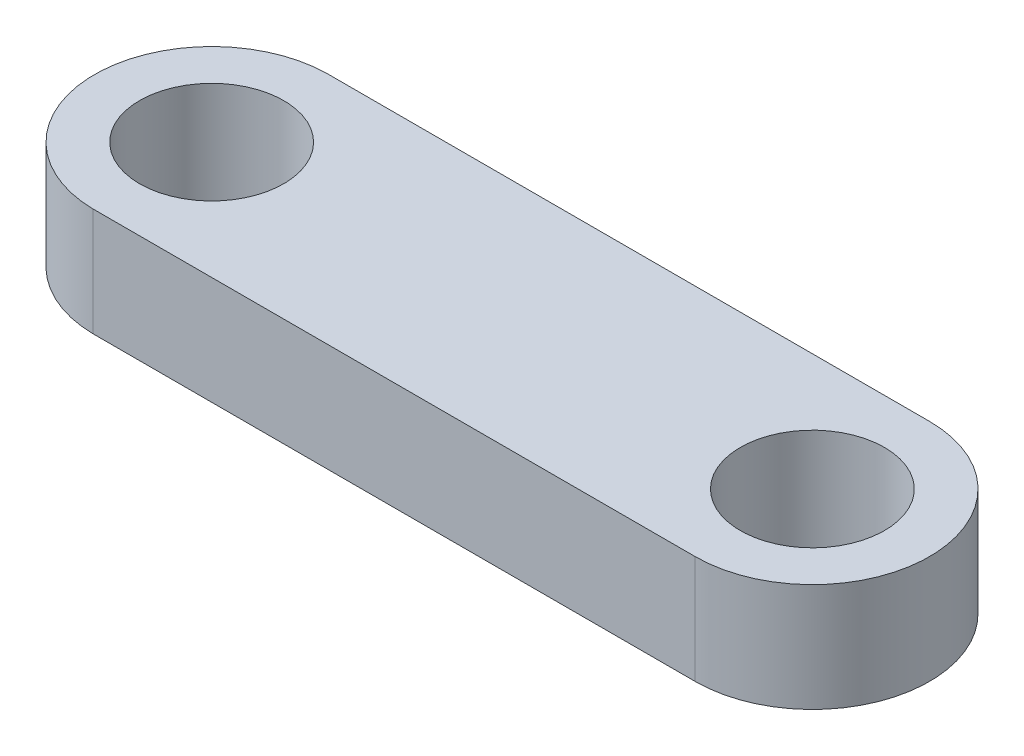
ISO-10303-21;
HEADER;
FILE_DESCRIPTION(('STEP AP214'),'2;1');
FILE_NAME('part.step','',(''),(''),'','','');
FILE_SCHEMA(('AUTOMOTIVE_DESIGN { 1 0 10303 214 1 1 1 1 }'));
ENDSEC;
DATA;
#1=APPLICATION_CONTEXT('core data for automotive mechanical design processes');
#2=APPLICATION_PROTOCOL_DEFINITION('international standard','automotive_design',2000,#1);
#3=PRODUCT_CONTEXT('',#1,'mechanical');
#4=PRODUCT('Part','Part','',(#3));
#5=PRODUCT_RELATED_PRODUCT_CATEGORY('part','',(#4));
#6=PRODUCT_DEFINITION_FORMATION('','',#4);
#7=PRODUCT_DEFINITION_CONTEXT('part definition',#1,'design');
#8=PRODUCT_DEFINITION('design','',#6,#7);
#9=PRODUCT_DEFINITION_SHAPE('','',#8);
#10=(LENGTH_UNIT() NAMED_UNIT(*) SI_UNIT(.MILLI.,.METRE.));
#11=(NAMED_UNIT(*) PLANE_ANGLE_UNIT() SI_UNIT($,.RADIAN.));
#12=(NAMED_UNIT(*) SI_UNIT($,.STERADIAN.) SOLID_ANGLE_UNIT());
#13=UNCERTAINTY_MEASURE_WITH_UNIT(LENGTH_MEASURE(1.E-05),#10,'distance_accuracy_value','');
#14=(GEOMETRIC_REPRESENTATION_CONTEXT(3) GLOBAL_UNCERTAINTY_ASSIGNED_CONTEXT((#13)) GLOBAL_UNIT_ASSIGNED_CONTEXT((#10,
#11,#12)) REPRESENTATION_CONTEXT('',''));
#15=CARTESIAN_POINT('',(0.,0.,0.));
#16=DIRECTION('',(0.,0.,1.));
#17=DIRECTION('',(1.,0.,0.));
#18=AXIS2_PLACEMENT_3D('',#15,#16,#17);
#19=CARTESIAN_POINT('',(-8.4455,3.81,-3.302));
#20=DIRECTION('',(0.,1.,0.));
#21=DIRECTION('',(0.,0.,1.));
#22=AXIS2_PLACEMENT_3D('',#19,#20,#21);
#23=PLANE('',#22);
#24=CARTESIAN_POINT('',(42.2275,3.81,-3.302));
#25=DIRECTION('',(0.,1.,0.));
#26=DIRECTION('',(0.,0.,1.));
#27=AXIS2_PLACEMENT_3D('',#24,#25,#26);
#28=CIRCLE('',#27,3.048);
#29=CARTESIAN_POINT('',(42.2275,3.81,-6.35));
#30=VERTEX_POINT('',#29);
#31=EDGE_CURVE('E104',#30,#30,#28,.T.);
#32=ORIENTED_EDGE('',*,*,#31,.F.);
#33=EDGE_LOOP('',(#32));
#34=FACE_BOUND('',#33,.T.);
#35=CARTESIAN_POINT('',(16.8275,3.81,-3.302));
#36=DIRECTION('',(0.,1.,0.));
#37=DIRECTION('',(0.,0.,1.));
#38=AXIS2_PLACEMENT_3D('',#35,#36,#37);
#39=CIRCLE('',#38,3.048);
#40=CARTESIAN_POINT('',(16.8275,3.81,-0.254000000000002));
#41=VERTEX_POINT('',#40);
#42=EDGE_CURVE('E117',#41,#41,#39,.T.);
#43=ORIENTED_EDGE('',*,*,#42,.F.);
#44=EDGE_LOOP('',(#43));
#45=FACE_BOUND('',#44,.T.);
#46=DIRECTION('',(-1.,0.,0.));
#47=VECTOR('',#46,1.);
#48=CARTESIAN_POINT('',(-8.4455,3.81,-8.255));
#49=LINE('',#48,#47);
#50=CARTESIAN_POINT('',(42.2275,3.81,-8.255));
#51=VERTEX_POINT('',#50);
#52=CARTESIAN_POINT('',(16.7640000000001,3.81,-8.255));
#53=VERTEX_POINT('',#52);
#54=EDGE_CURVE('E90',#51,#53,#49,.T.);
#55=ORIENTED_EDGE('',*,*,#54,.T.);
#56=CARTESIAN_POINT('',(16.8275,3.81,-3.302));
#57=DIRECTION('',(0.,1.,0.));
#58=DIRECTION('',(0.,0.,1.));
#59=AXIS2_PLACEMENT_3D('',#56,#57,#58);
#60=CIRCLE('',#59,4.95340703455712);
#61=CARTESIAN_POINT('',(16.7640000000001,3.81,1.651));
#62=VERTEX_POINT('',#61);
#63=EDGE_CURVE('E54',#53,#62,#60,.T.);
#64=ORIENTED_EDGE('',*,*,#63,.T.);
#65=DIRECTION('',(1.,0.,0.));
#66=VECTOR('',#65,1.);
#67=CARTESIAN_POINT('',(-8.4455,3.81,1.651));
#68=LINE('',#67,#66);
#69=CARTESIAN_POINT('',(42.2275,3.81,1.651));
#70=VERTEX_POINT('',#69);
#71=EDGE_CURVE('E97',#62,#70,#68,.T.);
#72=ORIENTED_EDGE('',*,*,#71,.T.);
#73=CARTESIAN_POINT('',(42.2275,3.81,-3.302));
#74=DIRECTION('',(0.,1.,0.));
#75=DIRECTION('',(0.,0.,-1.));
#76=AXIS2_PLACEMENT_3D('',#73,#74,#75);
#77=CIRCLE('',#76,4.953);
#78=EDGE_CURVE('E63',#70,#51,#77,.T.);
#79=ORIENTED_EDGE('',*,*,#78,.T.);
#80=EDGE_LOOP('',(#55,#64,#72,#79));
#81=FACE_BOUND('',#80,.T.);
#82=ADVANCED_FACE('F38',(#34,#45,#81),#23,.T.);
#83=CARTESIAN_POINT('',(-8.4455,-0.762,-3.302));
#84=DIRECTION('',(0.,1.,0.));
#85=DIRECTION('',(0.,0.,1.));
#86=AXIS2_PLACEMENT_3D('',#83,#84,#85);
#87=PLANE('',#86);
#88=CARTESIAN_POINT('',(42.2275,-0.762,-3.302));
#89=DIRECTION('',(0.,1.,0.));
#90=DIRECTION('',(0.,0.,1.));
#91=AXIS2_PLACEMENT_3D('',#88,#89,#90);
#92=CIRCLE('',#91,3.048);
#93=CARTESIAN_POINT('',(42.2275,-0.762000000000001,-6.35));
#94=VERTEX_POINT('',#93);
#95=EDGE_CURVE('E109',#94,#94,#92,.T.);
#96=ORIENTED_EDGE('',*,*,#95,.T.);
#97=EDGE_LOOP('',(#96));
#98=FACE_BOUND('',#97,.T.);
#99=CARTESIAN_POINT('',(16.8275,-0.762,-3.302));
#100=DIRECTION('',(0.,1.,0.));
#101=DIRECTION('',(0.,0.,1.));
#102=AXIS2_PLACEMENT_3D('',#99,#100,#101);
#103=CIRCLE('',#102,3.048);
#104=CARTESIAN_POINT('',(16.8275,-0.762,-0.254000000000002));
#105=VERTEX_POINT('',#104);
#106=EDGE_CURVE('E113',#105,#105,#103,.T.);
#107=ORIENTED_EDGE('',*,*,#106,.T.);
#108=EDGE_LOOP('',(#107));
#109=FACE_BOUND('',#108,.T.);
#110=CARTESIAN_POINT('',(16.8275,-0.762,-3.302));
#111=DIRECTION('',(0.,1.,0.));
#112=DIRECTION('',(0.,0.,1.));
#113=AXIS2_PLACEMENT_3D('',#110,#111,#112);
#114=CIRCLE('',#113,4.95340703455712);
#115=CARTESIAN_POINT('',(16.764,-0.762,-8.255));
#116=VERTEX_POINT('',#115);
#117=CARTESIAN_POINT('',(16.7640000000001,-0.762,1.651));
#118=VERTEX_POINT('',#117);
#119=EDGE_CURVE('E95',#116,#118,#114,.T.);
#120=ORIENTED_EDGE('',*,*,#119,.F.);
#121=DIRECTION('',(-1.,0.,0.));
#122=VECTOR('',#121,1.);
#123=CARTESIAN_POINT('',(-8.4455,-0.762,-8.255));
#124=LINE('',#123,#122);
#125=CARTESIAN_POINT('',(42.2275,-0.762,-8.255));
#126=VERTEX_POINT('',#125);
#127=EDGE_CURVE('E84',#126,#116,#124,.T.);
#128=ORIENTED_EDGE('',*,*,#127,.F.);
#129=CARTESIAN_POINT('',(42.2275,-0.762,-3.302));
#130=DIRECTION('',(0.,1.,0.));
#131=DIRECTION('',(0.,0.,-1.));
#132=AXIS2_PLACEMENT_3D('',#129,#130,#131);
#133=CIRCLE('',#132,4.953);
#134=CARTESIAN_POINT('',(42.2275,-0.762,1.651));
#135=VERTEX_POINT('',#134);
#136=EDGE_CURVE('E75',#135,#126,#133,.T.);
#137=ORIENTED_EDGE('',*,*,#136,.F.);
#138=DIRECTION('',(1.,0.,0.));
#139=VECTOR('',#138,1.);
#140=CARTESIAN_POINT('',(-8.4455,-0.762,1.651));
#141=LINE('',#140,#139);
#142=EDGE_CURVE('E85',#118,#135,#141,.T.);
#143=ORIENTED_EDGE('',*,*,#142,.F.);
#144=EDGE_LOOP('',(#120,#128,#137,#143));
#145=FACE_BOUND('',#144,.T.);
#146=ADVANCED_FACE('F93',(#98,#109,#145),#87,.F.);
#147=CARTESIAN_POINT('',(-8.4455,3.81,1.651));
#148=DIRECTION('',(0.,0.,-1.));
#149=DIRECTION('',(-1.,0.,0.));
#150=AXIS2_PLACEMENT_3D('',#147,#148,#149);
#151=PLANE('',#150);
#152=DIRECTION('',(0.,1.,0.));
#153=VECTOR('',#152,1.);
#154=CARTESIAN_POINT('',(16.7640000000001,-0.762,1.651));
#155=LINE('',#154,#153);
#156=EDGE_CURVE('E125',#118,#62,#155,.T.);
#157=ORIENTED_EDGE('',*,*,#156,.F.);
#158=ORIENTED_EDGE('',*,*,#142,.T.);
#159=DIRECTION('',(0.,-1.,0.));
#160=VECTOR('',#159,1.);
#161=CARTESIAN_POINT('',(42.2275,3.81,1.651));
#162=LINE('',#161,#160);
#163=EDGE_CURVE('E11',#70,#135,#162,.T.);
#164=ORIENTED_EDGE('',*,*,#163,.F.);
#165=ORIENTED_EDGE('',*,*,#71,.F.);
#166=EDGE_LOOP('',(#157,#158,#164,#165));
#167=FACE_BOUND('',#166,.T.);
#168=ADVANCED_FACE('F40',(#167),#151,.F.);
#169=CARTESIAN_POINT('',(-8.4455,3.81,-8.255));
#170=DIRECTION('',(0.,0.,1.));
#171=DIRECTION('',(1.,0.,0.));
#172=AXIS2_PLACEMENT_3D('',#169,#170,#171);
#173=PLANE('',#172);
#174=DIRECTION('',(0.,1.,0.));
#175=VECTOR('',#174,1.);
#176=CARTESIAN_POINT('',(16.764,-0.762,-8.255));
#177=LINE('',#176,#175);
#178=EDGE_CURVE('E121',#116,#53,#177,.T.);
#179=ORIENTED_EDGE('',*,*,#178,.T.);
#180=ORIENTED_EDGE('',*,*,#54,.F.);
#181=DIRECTION('',(0.,-1.,0.));
#182=VECTOR('',#181,1.);
#183=CARTESIAN_POINT('',(42.2275,3.81,-8.255));
#184=LINE('',#183,#182);
#185=EDGE_CURVE('E47',#51,#126,#184,.T.);
#186=ORIENTED_EDGE('',*,*,#185,.T.);
#187=ORIENTED_EDGE('',*,*,#127,.T.);
#188=EDGE_LOOP('',(#179,#180,#186,#187));
#189=FACE_BOUND('',#188,.T.);
#190=ADVANCED_FACE('F89',(#189),#173,.F.);
#191=CARTESIAN_POINT('',(42.2275,3.81,-3.302));
#192=DIRECTION('',(0.,-1.,0.));
#193=DIRECTION('',(0.,0.,-1.));
#194=AXIS2_PLACEMENT_3D('',#191,#192,#193);
#195=CYLINDRICAL_SURFACE('',#194,4.953);
#196=ORIENTED_EDGE('',*,*,#136,.T.);
#197=ORIENTED_EDGE('',*,*,#185,.F.);
#198=ORIENTED_EDGE('',*,*,#78,.F.);
#199=ORIENTED_EDGE('',*,*,#163,.T.);
#200=EDGE_LOOP('',(#196,#197,#198,#199));
#201=FACE_BOUND('',#200,.T.);
#202=ADVANCED_FACE('F77',(#201),#195,.T.);
#203=CARTESIAN_POINT('',(42.2275,3.81,-3.302));
#204=DIRECTION('',(0.,-1.,0.));
#205=DIRECTION('',(0.,0.,-1.));
#206=AXIS2_PLACEMENT_3D('',#203,#204,#205);
#207=CYLINDRICAL_SURFACE('',#206,3.048);
#208=CARTESIAN_POINT('',(42.2275,3.81,-6.35));
#209=CARTESIAN_POINT('',(42.2275,3.762375,-6.35));
#210=CARTESIAN_POINT('',(42.2275,3.71475,-6.35));
#211=CARTESIAN_POINT('',(42.2275,3.6195,-6.35));
#212=CARTESIAN_POINT('',(42.2275,3.571875,-6.35));
#213=CARTESIAN_POINT('',(42.2275,3.476625,-6.35));
#214=CARTESIAN_POINT('',(42.2275,3.429,-6.35));
#215=CARTESIAN_POINT('',(42.2275,3.33375,-6.35));
#216=CARTESIAN_POINT('',(42.2275,3.286125,-6.35));
#217=CARTESIAN_POINT('',(42.2275,3.190875,-6.35));
#218=CARTESIAN_POINT('',(42.2275,3.14325,-6.35));
#219=CARTESIAN_POINT('',(42.2275,3.048,-6.35));
#220=CARTESIAN_POINT('',(42.2275,3.000375,-6.35));
#221=CARTESIAN_POINT('',(42.2275,2.905125,-6.35));
#222=CARTESIAN_POINT('',(42.2275,2.8575,-6.35));
#223=CARTESIAN_POINT('',(42.2275,2.76225,-6.35));
#224=CARTESIAN_POINT('',(42.2275,2.714625,-6.35));
#225=CARTESIAN_POINT('',(42.2275,2.619375,-6.35));
#226=CARTESIAN_POINT('',(42.2275,2.57175,-6.35));
#227=CARTESIAN_POINT('',(42.2275,2.4765,-6.35));
#228=CARTESIAN_POINT('',(42.2275,2.428875,-6.35));
#229=CARTESIAN_POINT('',(42.2275,2.333625,-6.35));
#230=CARTESIAN_POINT('',(42.2275,2.286,-6.35));
#231=CARTESIAN_POINT('',(42.2275,2.19075,-6.35));
#232=CARTESIAN_POINT('',(42.2275,2.143125,-6.35));
#233=CARTESIAN_POINT('',(42.2275,2.047875,-6.35));
#234=CARTESIAN_POINT('',(42.2275,2.00025,-6.35));
#235=CARTESIAN_POINT('',(42.2275,1.905,-6.35));
#236=CARTESIAN_POINT('',(42.2275,1.857375,-6.35));
#237=CARTESIAN_POINT('',(42.2275,1.762125,-6.35));
#238=CARTESIAN_POINT('',(42.2275,1.7145,-6.35));
#239=CARTESIAN_POINT('',(42.2275,1.61925,-6.35));
#240=CARTESIAN_POINT('',(42.2275,1.571625,-6.35));
#241=CARTESIAN_POINT('',(42.2275,1.476375,-6.35));
#242=CARTESIAN_POINT('',(42.2275,1.42875,-6.35));
#243=CARTESIAN_POINT('',(42.2275,1.3335,-6.35));
#244=CARTESIAN_POINT('',(42.2275,1.285875,-6.35));
#245=CARTESIAN_POINT('',(42.2275,1.190625,-6.35));
#246=CARTESIAN_POINT('',(42.2275,1.143,-6.35));
#247=CARTESIAN_POINT('',(42.2275,1.04775,-6.35));
#248=CARTESIAN_POINT('',(42.2275,1.000125,-6.35));
#249=CARTESIAN_POINT('',(42.2275,0.904874999999999,-6.35));
#250=CARTESIAN_POINT('',(42.2275,0.857249999999999,-6.35));
#251=CARTESIAN_POINT('',(42.2275,0.761999999999999,-6.35));
#252=CARTESIAN_POINT('',(42.2275,0.714374999999999,-6.35));
#253=CARTESIAN_POINT('',(42.2275,0.619124999999999,-6.35));
#254=CARTESIAN_POINT('',(42.2275,0.571499999999999,-6.35));
#255=CARTESIAN_POINT('',(42.2275,0.476249999999999,-6.35));
#256=CARTESIAN_POINT('',(42.2275,0.428624999999999,-6.35));
#257=CARTESIAN_POINT('',(42.2275,0.333374999999999,-6.35));
#258=CARTESIAN_POINT('',(42.2275,0.285749999999999,-6.35));
#259=CARTESIAN_POINT('',(42.2275,0.190499999999999,-6.35));
#260=CARTESIAN_POINT('',(42.2275,0.142874999999999,-6.35));
#261=CARTESIAN_POINT('',(42.2275,0.0476249999999989,-6.35));
#262=CARTESIAN_POINT('',(42.2275,0.,-6.35));
#263=CARTESIAN_POINT('',(42.2275,-0.0952500000000012,-6.35));
#264=CARTESIAN_POINT('',(42.2275,-0.142875000000001,-6.35));
#265=CARTESIAN_POINT('',(42.2275,-0.238125000000001,-6.35));
#266=CARTESIAN_POINT('',(42.2275,-0.285750000000001,-6.35));
#267=CARTESIAN_POINT('',(42.2275,-0.381000000000001,-6.35));
#268=CARTESIAN_POINT('',(42.2275,-0.428625000000001,-6.35));
#269=CARTESIAN_POINT('',(42.2275,-0.523875000000001,-6.35));
#270=CARTESIAN_POINT('',(42.2275,-0.571500000000001,-6.35));
#271=CARTESIAN_POINT('',(42.2275,-0.666750000000001,-6.35));
#272=CARTESIAN_POINT('',(42.2275,-0.714375000000001,-6.35));
#273=CARTESIAN_POINT('',(42.2275,-0.762000000000001,-6.35));
#274=B_SPLINE_CURVE_WITH_KNOTS('',3,(#208,#209,#210,#211,#212,#213,#214,#215,#216,#217,#218,
#219,#220,#221,#222,#223,#224,#225,#226,#227,#228,#229,#230,#231,#232,#233,#234,#235,#236,#237,
#238,#239,#240,#241,#242,#243,#244,#245,#246,#247,#248,#249,#250,#251,#252,#253,#254,#255,#256,
#257,#258,#259,#260,#261,#262,#263,#264,#265,#266,#267,#268,#269,#270,#271,#272,#273),
.UNSPECIFIED.,.F.,.F.,(4,2,2,2,2,2,2,2,2,2,2,2,2,2,2,2,2,2,2,2,2,2,2,2,2,2,2,2,2,2,2,2,4),(0.,
0.142875,0.28575,0.428625,0.5715,0.714375,0.85725,1.000125,1.143,1.285875,1.42875,1.571625,
1.7145,1.857375,2.00025,2.143125,2.286,2.428875,2.57175,2.714625,2.8575,3.000375,3.14325,
3.286125,3.429,3.571875,3.71475,3.857625,4.0005,4.143375,4.28625,4.429125,4.572),.UNSPECIFIED.);
#275=EDGE_CURVE('BSEAM152',#30,#94,#274,.T.);
#276=ORIENTED_EDGE('',*,*,#31,.T.);
#277=ORIENTED_EDGE('',*,*,#95,.F.);
#278=ORIENTED_EDGE('',*,*,#275,.T.);
#279=ORIENTED_EDGE('',*,*,#275,.F.);
#280=EDGE_LOOP('',(#276,#278,#277,#279));
#281=FACE_BOUND('',#280,.T.);
#282=ADVANCED_FACE('F152',(#281),#207,.F.);
#283=CARTESIAN_POINT('',(16.8275,-0.762,-3.302));
#284=DIRECTION('',(0.,1.,0.));
#285=DIRECTION('',(0.,0.,1.));
#286=AXIS2_PLACEMENT_3D('',#283,#284,#285);
#287=CYLINDRICAL_SURFACE('',#286,3.048);
#288=ORIENTED_EDGE('',*,*,#106,.F.);
#289=EDGE_LOOP('',(#288));
#290=FACE_BOUND('',#289,.T.);
#291=ORIENTED_EDGE('',*,*,#42,.T.);
#292=EDGE_LOOP('',(#291));
#293=FACE_BOUND('',#292,.T.);
#294=ADVANCED_FACE('F160',(#290,#293),#287,.F.);
#295=CARTESIAN_POINT('',(16.8275,-0.762,-3.302));
#296=DIRECTION('',(0.,1.,0.));
#297=DIRECTION('',(0.,0.,1.));
#298=AXIS2_PLACEMENT_3D('',#295,#296,#297);
#299=CYLINDRICAL_SURFACE('',#298,4.95340703455712);
#300=ORIENTED_EDGE('',*,*,#63,.F.);
#301=ORIENTED_EDGE('',*,*,#178,.F.);
#302=ORIENTED_EDGE('',*,*,#119,.T.);
#303=ORIENTED_EDGE('',*,*,#156,.T.);
#304=EDGE_LOOP('',(#300,#301,#302,#303));
#305=FACE_BOUND('',#304,.T.);
#306=ADVANCED_FACE('F135',(#305),#299,.T.);
#307=CLOSED_SHELL('',(#82,#146,#168,#190,#202,#282,#294,#306));
#308=MANIFOLD_SOLID_BREP('B2',#307);
#309=ADVANCED_BREP_SHAPE_REPRESENTATION('',(#18,#308),#14);
#310=SHAPE_DEFINITION_REPRESENTATION(#9,#309);
ENDSEC;
END-ISO-10303-21;
